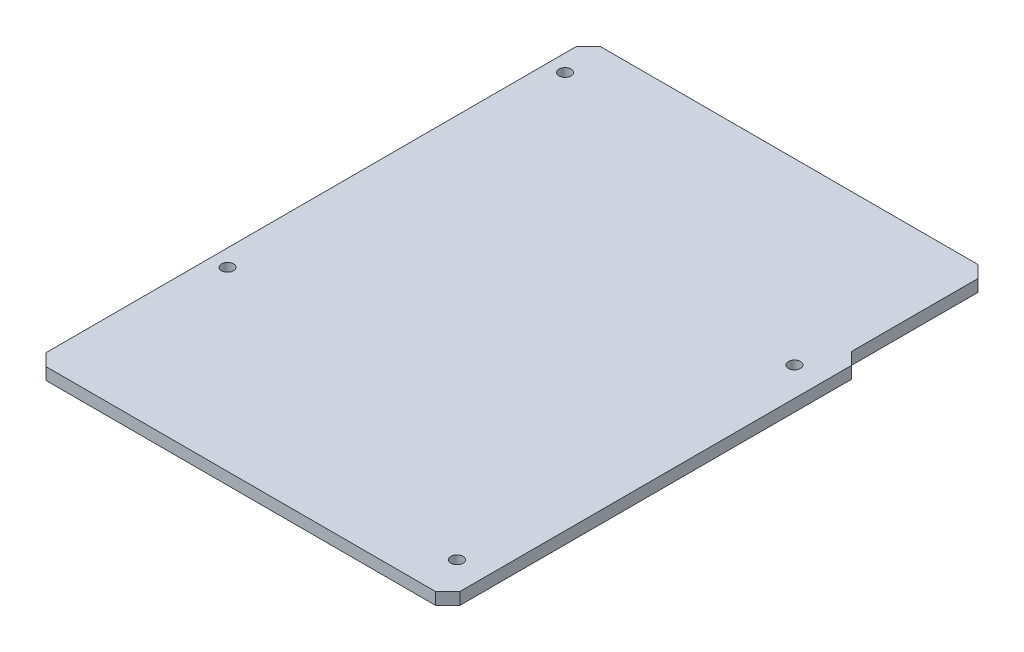
ISO-10303-21;
HEADER;
FILE_DESCRIPTION(('STEP AP214'),'2;1');
FILE_NAME('part.step','',(''),(''),'','','');
FILE_SCHEMA(('AUTOMOTIVE_DESIGN { 1 0 10303 214 1 1 1 1 }'));
ENDSEC;
DATA;
#1=APPLICATION_CONTEXT('core data for automotive mechanical design processes');
#2=APPLICATION_PROTOCOL_DEFINITION('international standard','automotive_design',2000,#1);
#3=PRODUCT_CONTEXT('',#1,'mechanical');
#4=PRODUCT('Part','Part','',(#3));
#5=PRODUCT_RELATED_PRODUCT_CATEGORY('part','',(#4));
#6=PRODUCT_DEFINITION_FORMATION('','',#4);
#7=PRODUCT_DEFINITION_CONTEXT('part definition',#1,'design');
#8=PRODUCT_DEFINITION('design','',#6,#7);
#9=PRODUCT_DEFINITION_SHAPE('','',#8);
#10=(LENGTH_UNIT() NAMED_UNIT(*) SI_UNIT(.MILLI.,.METRE.));
#11=(NAMED_UNIT(*) PLANE_ANGLE_UNIT() SI_UNIT($,.RADIAN.));
#12=(NAMED_UNIT(*) SI_UNIT($,.STERADIAN.) SOLID_ANGLE_UNIT());
#13=UNCERTAINTY_MEASURE_WITH_UNIT(LENGTH_MEASURE(1.E-05),#10,'distance_accuracy_value','');
#14=(GEOMETRIC_REPRESENTATION_CONTEXT(3) GLOBAL_UNCERTAINTY_ASSIGNED_CONTEXT((#13)) GLOBAL_UNIT_ASSIGNED_CONTEXT((#10,
#11,#12)) REPRESENTATION_CONTEXT('',''));
#15=CARTESIAN_POINT('',(0.,0.,0.));
#16=DIRECTION('',(0.,0.,1.));
#17=DIRECTION('',(1.,0.,0.));
#18=AXIS2_PLACEMENT_3D('',#15,#16,#17);
#19=CARTESIAN_POINT('',(0.,3.,0.));
#20=DIRECTION('',(0.,1.,0.));
#21=DIRECTION('',(0.,0.,1.));
#22=AXIS2_PLACEMENT_3D('',#19,#20,#21);
#23=PLANE('',#22);
#24=DIRECTION('',(0.,0.,1.));
#25=VECTOR('',#24,1.);
#26=CARTESIAN_POINT('',(-50.,3.,72.5));
#27=LINE('',#26,#25);
#28=CARTESIAN_POINT('',(-50.,3.,-62.5));
#29=VERTEX_POINT('',#28);
#30=CARTESIAN_POINT('',(-50.,3.,69.5));
#31=VERTEX_POINT('',#30);
#32=EDGE_CURVE('E176',#29,#31,#27,.T.);
#33=ORIENTED_EDGE('',*,*,#32,.T.);
#34=DIRECTION('',(-0.707106781186548,0.,-0.707106781186548));
#35=VECTOR('',#34,1.);
#36=CARTESIAN_POINT('',(-59.75,3.,59.75));
#37=LINE('',#36,#35);
#38=CARTESIAN_POINT('',(-47.,3.,72.5));
#39=VERTEX_POINT('',#38);
#40=EDGE_CURVE('E11',#31,#39,#37,.F.);
#41=ORIENTED_EDGE('',*,*,#40,.T.);
#42=DIRECTION('',(1.,0.,0.));
#43=VECTOR('',#42,1.);
#44=CARTESIAN_POINT('',(50.,3.,72.5));
#45=LINE('',#44,#43);
#46=CARTESIAN_POINT('',(50.,3.,72.5));
#47=VERTEX_POINT('',#46);
#48=EDGE_CURVE('E178',#39,#47,#45,.T.);
#49=ORIENTED_EDGE('',*,*,#48,.T.);
#50=DIRECTION('',(-0.707106781186549,0.,0.707106781186546));
#51=VECTOR('',#50,1.);
#52=CARTESIAN_POINT('',(50.,3.,72.5));
#53=LINE('',#52,#51);
#54=CARTESIAN_POINT('',(53.,3.,69.5));
#55=VERTEX_POINT('',#54);
#56=EDGE_CURVE('E117',#55,#47,#53,.T.);
#57=ORIENTED_EDGE('',*,*,#56,.F.);
#58=DIRECTION('',(0.,0.,1.));
#59=VECTOR('',#58,1.);
#60=CARTESIAN_POINT('',(53.,3.,69.5));
#61=LINE('',#60,#59);
#62=CARTESIAN_POINT('',(53.,3.,-28.));
#63=VERTEX_POINT('',#62);
#64=EDGE_CURVE('E109',#63,#55,#61,.T.);
#65=ORIENTED_EDGE('',*,*,#64,.F.);
#66=DIRECTION('',(0.707106781186548,0.,0.707106781186548));
#67=VECTOR('',#66,1.);
#68=CARTESIAN_POINT('',(53.,3.,-28.));
#69=LINE('',#68,#67);
#70=CARTESIAN_POINT('',(50.,3.,-31.));
#71=VERTEX_POINT('',#70);
#72=EDGE_CURVE('E114',#71,#63,#69,.T.);
#73=ORIENTED_EDGE('',*,*,#72,.F.);
#74=DIRECTION('',(0.,0.,-1.));
#75=VECTOR('',#74,1.);
#76=CARTESIAN_POINT('',(50.,3.,72.5));
#77=LINE('',#76,#75);
#78=CARTESIAN_POINT('',(50.,3.,-62.5));
#79=VERTEX_POINT('',#78);
#80=EDGE_CURVE('E181',#71,#79,#77,.T.);
#81=ORIENTED_EDGE('',*,*,#80,.T.);
#82=DIRECTION('',(0.707106781186549,0.,0.707106781186546));
#83=VECTOR('',#82,1.);
#84=CARTESIAN_POINT('',(56.2499999999999,3.,-56.2500000000002));
#85=LINE('',#84,#83);
#86=CARTESIAN_POINT('',(47.,3.,-65.5));
#87=VERTEX_POINT('',#86);
#88=EDGE_CURVE('E196',#79,#87,#85,.F.);
#89=ORIENTED_EDGE('',*,*,#88,.T.);
#90=DIRECTION('',(1.,0.,0.));
#91=VECTOR('',#90,1.);
#92=CARTESIAN_POINT('',(50.,3.,-65.5));
#93=LINE('',#92,#91);
#94=CARTESIAN_POINT('',(-47.,3.,-65.5));
#95=VERTEX_POINT('',#94);
#96=EDGE_CURVE('E145',#95,#87,#93,.T.);
#97=ORIENTED_EDGE('',*,*,#96,.F.);
#98=DIRECTION('',(0.707106781186548,0.,-0.707106781186548));
#99=VECTOR('',#98,1.);
#100=CARTESIAN_POINT('',(-56.25,3.,-56.25));
#101=LINE('',#100,#99);
#102=EDGE_CURVE('E198',#95,#29,#101,.F.);
#103=ORIENTED_EDGE('',*,*,#102,.T.);
#104=EDGE_LOOP('',(#33,#41,#49,#57,#65,#73,#81,#89,#97,#103));
#105=FACE_BOUND('',#104,.T.);
#106=CARTESIAN_POINT('',(45.8,3.,63.));
#107=DIRECTION('',(0.,1.,0.));
#108=DIRECTION('',(0.,0.,-1.));
#109=AXIS2_PLACEMENT_3D('',#106,#107,#108);
#110=CIRCLE('',#109,1.5);
#111=CARTESIAN_POINT('',(45.8,3.,61.5));
#112=VERTEX_POINT('',#111);
#113=EDGE_CURVE('E158',#112,#112,#110,.T.);
#114=ORIENTED_EDGE('',*,*,#113,.F.);
#115=EDGE_LOOP('',(#114));
#116=FACE_BOUND('',#115,.T.);
#117=CARTESIAN_POINT('',(-45.8,3.,-55.5));
#118=DIRECTION('',(0.,1.,0.));
#119=DIRECTION('',(0.,0.,1.));
#120=AXIS2_PLACEMENT_3D('',#117,#118,#119);
#121=CIRCLE('',#120,1.5);
#122=CARTESIAN_POINT('',(-45.8,3.,-54.));
#123=VERTEX_POINT('',#122);
#124=EDGE_CURVE('E170',#123,#123,#121,.T.);
#125=ORIENTED_EDGE('',*,*,#124,.F.);
#126=EDGE_LOOP('',(#125));
#127=FACE_BOUND('',#126,.T.);
#128=CARTESIAN_POINT('',(-45.8,3.,28.5));
#129=DIRECTION('',(0.,1.,0.));
#130=DIRECTION('',(0.,0.,1.));
#131=AXIS2_PLACEMENT_3D('',#128,#129,#130);
#132=CIRCLE('',#131,1.5);
#133=CARTESIAN_POINT('',(-45.8,3.,30.));
#134=VERTEX_POINT('',#133);
#135=EDGE_CURVE('E164',#134,#134,#132,.T.);
#136=ORIENTED_EDGE('',*,*,#135,.F.);
#137=EDGE_LOOP('',(#136));
#138=FACE_BOUND('',#137,.T.);
#139=CARTESIAN_POINT('',(45.8,3.,-21.));
#140=DIRECTION('',(0.,1.,0.));
#141=DIRECTION('',(0.,0.,-1.));
#142=AXIS2_PLACEMENT_3D('',#139,#140,#141);
#143=CIRCLE('',#142,1.5);
#144=CARTESIAN_POINT('',(45.8,3.,-22.5));
#145=VERTEX_POINT('',#144);
#146=EDGE_CURVE('E152',#145,#145,#143,.T.);
#147=ORIENTED_EDGE('',*,*,#146,.F.);
#148=EDGE_LOOP('',(#147));
#149=FACE_BOUND('',#148,.T.);
#150=ADVANCED_FACE('F33',(#105,#116,#127,#138,#149),#23,.T.);
#151=CARTESIAN_POINT('',(0.,0.,0.));
#152=DIRECTION('',(0.,1.,0.));
#153=DIRECTION('',(0.,0.,1.));
#154=AXIS2_PLACEMENT_3D('',#151,#152,#153);
#155=PLANE('',#154);
#156=DIRECTION('',(1.,0.,0.));
#157=VECTOR('',#156,1.);
#158=CARTESIAN_POINT('',(50.,0.,72.5));
#159=LINE('',#158,#157);
#160=CARTESIAN_POINT('',(-47.,0.,72.5));
#161=VERTEX_POINT('',#160);
#162=CARTESIAN_POINT('',(50.,0.,72.5));
#163=VERTEX_POINT('',#162);
#164=EDGE_CURVE('E185',#161,#163,#159,.T.);
#165=ORIENTED_EDGE('',*,*,#164,.F.);
#166=DIRECTION('',(0.707106781186548,0.,0.707106781186548));
#167=VECTOR('',#166,1.);
#168=CARTESIAN_POINT('',(-47.,0.,72.5));
#169=LINE('',#168,#167);
#170=CARTESIAN_POINT('',(-50.,0.,69.5));
#171=VERTEX_POINT('',#170);
#172=EDGE_CURVE('E55',#161,#171,#169,.F.);
#173=ORIENTED_EDGE('',*,*,#172,.T.);
#174=DIRECTION('',(0.,0.,1.));
#175=VECTOR('',#174,1.);
#176=CARTESIAN_POINT('',(-50.,0.,72.5));
#177=LINE('',#176,#175);
#178=CARTESIAN_POINT('',(-50.,0.,-62.5));
#179=VERTEX_POINT('',#178);
#180=EDGE_CURVE('E173',#179,#171,#177,.T.);
#181=ORIENTED_EDGE('',*,*,#180,.F.);
#182=DIRECTION('',(-0.707106781186548,0.,0.707106781186548));
#183=VECTOR('',#182,1.);
#184=CARTESIAN_POINT('',(-47.,0.,-65.5));
#185=LINE('',#184,#183);
#186=CARTESIAN_POINT('',(-47.,0.,-65.5));
#187=VERTEX_POINT('',#186);
#188=EDGE_CURVE('E204',#179,#187,#185,.F.);
#189=ORIENTED_EDGE('',*,*,#188,.T.);
#190=DIRECTION('',(1.,0.,0.));
#191=VECTOR('',#190,1.);
#192=CARTESIAN_POINT('',(50.,0.,-65.5));
#193=LINE('',#192,#191);
#194=CARTESIAN_POINT('',(47.,0.,-65.5));
#195=VERTEX_POINT('',#194);
#196=EDGE_CURVE('E146',#187,#195,#193,.T.);
#197=ORIENTED_EDGE('',*,*,#196,.T.);
#198=DIRECTION('',(-0.707106781186549,0.,-0.707106781186546));
#199=VECTOR('',#198,1.);
#200=CARTESIAN_POINT('',(50.,0.,-62.5));
#201=LINE('',#200,#199);
#202=CARTESIAN_POINT('',(50.,0.,-62.5));
#203=VERTEX_POINT('',#202);
#204=EDGE_CURVE('E202',#195,#203,#201,.F.);
#205=ORIENTED_EDGE('',*,*,#204,.T.);
#206=DIRECTION('',(0.,0.,-1.));
#207=VECTOR('',#206,1.);
#208=CARTESIAN_POINT('',(50.,0.,72.5));
#209=LINE('',#208,#207);
#210=CARTESIAN_POINT('',(50.,0.,-31.));
#211=VERTEX_POINT('',#210);
#212=EDGE_CURVE('E179',#211,#203,#209,.T.);
#213=ORIENTED_EDGE('',*,*,#212,.F.);
#214=DIRECTION('',(0.707106781186548,0.,0.707106781186548));
#215=VECTOR('',#214,1.);
#216=CARTESIAN_POINT('',(53.,0.,-28.));
#217=LINE('',#216,#215);
#218=CARTESIAN_POINT('',(53.,0.,-28.));
#219=VERTEX_POINT('',#218);
#220=EDGE_CURVE('E140',#211,#219,#217,.T.);
#221=ORIENTED_EDGE('',*,*,#220,.T.);
#222=DIRECTION('',(0.,0.,1.));
#223=VECTOR('',#222,1.);
#224=CARTESIAN_POINT('',(53.,0.,69.5));
#225=LINE('',#224,#223);
#226=CARTESIAN_POINT('',(53.,0.,69.5));
#227=VERTEX_POINT('',#226);
#228=EDGE_CURVE('E126',#219,#227,#225,.T.);
#229=ORIENTED_EDGE('',*,*,#228,.T.);
#230=DIRECTION('',(-0.707106781186549,0.,0.707106781186546));
#231=VECTOR('',#230,1.);
#232=CARTESIAN_POINT('',(50.,0.,72.5));
#233=LINE('',#232,#231);
#234=EDGE_CURVE('E134',#227,#163,#233,.T.);
#235=ORIENTED_EDGE('',*,*,#234,.T.);
#236=EDGE_LOOP('',(#165,#173,#181,#189,#197,#205,#213,#221,#229,#235));
#237=FACE_BOUND('',#236,.T.);
#238=CARTESIAN_POINT('',(-45.8,0.,-55.5));
#239=DIRECTION('',(0.,1.,0.));
#240=DIRECTION('',(0.,0.,1.));
#241=AXIS2_PLACEMENT_3D('',#238,#239,#240);
#242=CIRCLE('',#241,1.5);
#243=CARTESIAN_POINT('',(-45.8,0.,-54.));
#244=VERTEX_POINT('',#243);
#245=EDGE_CURVE('E167',#244,#244,#242,.T.);
#246=ORIENTED_EDGE('',*,*,#245,.T.);
#247=EDGE_LOOP('',(#246));
#248=FACE_BOUND('',#247,.T.);
#249=CARTESIAN_POINT('',(-45.8,0.,28.5));
#250=DIRECTION('',(0.,1.,0.));
#251=DIRECTION('',(0.,0.,1.));
#252=AXIS2_PLACEMENT_3D('',#249,#250,#251);
#253=CIRCLE('',#252,1.5);
#254=CARTESIAN_POINT('',(-45.8,0.,30.));
#255=VERTEX_POINT('',#254);
#256=EDGE_CURVE('E161',#255,#255,#253,.T.);
#257=ORIENTED_EDGE('',*,*,#256,.T.);
#258=EDGE_LOOP('',(#257));
#259=FACE_BOUND('',#258,.T.);
#260=CARTESIAN_POINT('',(45.8,0.,63.));
#261=DIRECTION('',(0.,1.,0.));
#262=DIRECTION('',(0.,0.,-1.));
#263=AXIS2_PLACEMENT_3D('',#260,#261,#262);
#264=CIRCLE('',#263,1.5);
#265=CARTESIAN_POINT('',(45.8,0.,61.5));
#266=VERTEX_POINT('',#265);
#267=EDGE_CURVE('E155',#266,#266,#264,.T.);
#268=ORIENTED_EDGE('',*,*,#267,.T.);
#269=EDGE_LOOP('',(#268));
#270=FACE_BOUND('',#269,.T.);
#271=CARTESIAN_POINT('',(45.8,0.,-21.));
#272=DIRECTION('',(0.,1.,0.));
#273=DIRECTION('',(0.,0.,-1.));
#274=AXIS2_PLACEMENT_3D('',#271,#272,#273);
#275=CIRCLE('',#274,1.5);
#276=CARTESIAN_POINT('',(45.8,0.,-22.5));
#277=VERTEX_POINT('',#276);
#278=EDGE_CURVE('E149',#277,#277,#275,.T.);
#279=ORIENTED_EDGE('',*,*,#278,.T.);
#280=EDGE_LOOP('',(#279));
#281=FACE_BOUND('',#280,.T.);
#282=ADVANCED_FACE('F219',(#237,#248,#259,#270,#281),#155,.F.);
#283=CARTESIAN_POINT('',(-50.,3.,72.5));
#284=DIRECTION('',(1.,0.,0.));
#285=DIRECTION('',(0.,0.,-1.));
#286=AXIS2_PLACEMENT_3D('',#283,#284,#285);
#287=PLANE('',#286);
#288=ORIENTED_EDGE('',*,*,#180,.T.);
#289=DIRECTION('',(0.,1.,0.));
#290=VECTOR('',#289,1.);
#291=CARTESIAN_POINT('',(-50.,3.,69.5));
#292=LINE('',#291,#290);
#293=EDGE_CURVE('E41',#171,#31,#292,.T.);
#294=ORIENTED_EDGE('',*,*,#293,.T.);
#295=ORIENTED_EDGE('',*,*,#32,.F.);
#296=DIRECTION('',(0.,-1.,0.));
#297=VECTOR('',#296,1.);
#298=CARTESIAN_POINT('',(-50.,3.,-62.5));
#299=LINE('',#298,#297);
#300=EDGE_CURVE('E200',#29,#179,#299,.T.);
#301=ORIENTED_EDGE('',*,*,#300,.T.);
#302=EDGE_LOOP('',(#288,#294,#295,#301));
#303=FACE_BOUND('',#302,.T.);
#304=ADVANCED_FACE('F240',(#303),#287,.F.);
#305=CARTESIAN_POINT('',(50.,3.,72.5));
#306=DIRECTION('',(0.,0.,-1.));
#307=DIRECTION('',(-1.,0.,0.));
#308=AXIS2_PLACEMENT_3D('',#305,#306,#307);
#309=PLANE('',#308);
#310=ORIENTED_EDGE('',*,*,#48,.F.);
#311=DIRECTION('',(0.,-1.,0.));
#312=VECTOR('',#311,1.);
#313=CARTESIAN_POINT('',(-47.,3.,72.5));
#314=LINE('',#313,#312);
#315=EDGE_CURVE('E209',#39,#161,#314,.T.);
#316=ORIENTED_EDGE('',*,*,#315,.T.);
#317=ORIENTED_EDGE('',*,*,#164,.T.);
#318=DIRECTION('',(0.,-1.,0.));
#319=VECTOR('',#318,1.);
#320=CARTESIAN_POINT('',(50.,3.,72.5));
#321=LINE('',#320,#319);
#322=EDGE_CURVE('E183',#47,#163,#321,.T.);
#323=ORIENTED_EDGE('',*,*,#322,.F.);
#324=EDGE_LOOP('',(#310,#316,#317,#323));
#325=FACE_BOUND('',#324,.T.);
#326=ADVANCED_FACE('F215',(#325),#309,.F.);
#327=CARTESIAN_POINT('',(50.,3.,72.5));
#328=DIRECTION('',(-1.,0.,0.));
#329=DIRECTION('',(0.,0.,1.));
#330=AXIS2_PLACEMENT_3D('',#327,#328,#329);
#331=PLANE('',#330);
#332=ORIENTED_EDGE('',*,*,#212,.T.);
#333=DIRECTION('',(0.,1.,0.));
#334=VECTOR('',#333,1.);
#335=CARTESIAN_POINT('',(50.,3.,-62.5));
#336=LINE('',#335,#334);
#337=EDGE_CURVE('E206',#203,#79,#336,.T.);
#338=ORIENTED_EDGE('',*,*,#337,.T.);
#339=ORIENTED_EDGE('',*,*,#80,.F.);
#340=DIRECTION('',(0.,-1.,0.));
#341=VECTOR('',#340,1.);
#342=CARTESIAN_POINT('',(50.,106.543469132534,-31.));
#343=LINE('',#342,#341);
#344=EDGE_CURVE('E132',#71,#211,#343,.T.);
#345=ORIENTED_EDGE('',*,*,#344,.T.);
#346=EDGE_LOOP('',(#332,#338,#339,#345));
#347=FACE_BOUND('',#346,.T.);
#348=ADVANCED_FACE('F246',(#347),#331,.F.);
#349=CARTESIAN_POINT('',(-45.8,3.,-55.5));
#350=DIRECTION('',(0.,-1.,0.));
#351=DIRECTION('',(0.,0.,-1.));
#352=AXIS2_PLACEMENT_3D('',#349,#350,#351);
#353=CYLINDRICAL_SURFACE('',#352,1.5);
#354=ORIENTED_EDGE('',*,*,#124,.T.);
#355=EDGE_LOOP('',(#354));
#356=FACE_BOUND('',#355,.T.);
#357=ORIENTED_EDGE('',*,*,#245,.F.);
#358=EDGE_LOOP('',(#357));
#359=FACE_BOUND('',#358,.T.);
#360=ADVANCED_FACE('F243',(#356,#359),#353,.F.);
#361=CARTESIAN_POINT('',(-45.8,3.,28.5));
#362=DIRECTION('',(0.,-1.,0.));
#363=DIRECTION('',(0.,0.,-1.));
#364=AXIS2_PLACEMENT_3D('',#361,#362,#363);
#365=CYLINDRICAL_SURFACE('',#364,1.5);
#366=ORIENTED_EDGE('',*,*,#135,.T.);
#367=EDGE_LOOP('',(#366));
#368=FACE_BOUND('',#367,.T.);
#369=ORIENTED_EDGE('',*,*,#256,.F.);
#370=EDGE_LOOP('',(#369));
#371=FACE_BOUND('',#370,.T.);
#372=ADVANCED_FACE('F282',(#368,#371),#365,.F.);
#373=CARTESIAN_POINT('',(45.8,3.,63.));
#374=DIRECTION('',(0.,-1.,0.));
#375=DIRECTION('',(0.,0.,-1.));
#376=AXIS2_PLACEMENT_3D('',#373,#374,#375);
#377=CYLINDRICAL_SURFACE('',#376,1.5);
#378=ORIENTED_EDGE('',*,*,#113,.T.);
#379=EDGE_LOOP('',(#378));
#380=FACE_BOUND('',#379,.T.);
#381=ORIENTED_EDGE('',*,*,#267,.F.);
#382=EDGE_LOOP('',(#381));
#383=FACE_BOUND('',#382,.T.);
#384=ADVANCED_FACE('F277',(#380,#383),#377,.F.);
#385=CARTESIAN_POINT('',(45.8,3.,-21.));
#386=DIRECTION('',(0.,-1.,0.));
#387=DIRECTION('',(0.,0.,-1.));
#388=AXIS2_PLACEMENT_3D('',#385,#386,#387);
#389=CYLINDRICAL_SURFACE('',#388,1.5);
#390=ORIENTED_EDGE('',*,*,#146,.T.);
#391=EDGE_LOOP('',(#390));
#392=FACE_BOUND('',#391,.T.);
#393=ORIENTED_EDGE('',*,*,#278,.F.);
#394=EDGE_LOOP('',(#393));
#395=FACE_BOUND('',#394,.T.);
#396=ADVANCED_FACE('F270',(#392,#395),#389,.F.);
#397=CARTESIAN_POINT('',(50.,0.,-65.5));
#398=DIRECTION('',(0.,0.,1.));
#399=DIRECTION('',(1.,0.,0.));
#400=AXIS2_PLACEMENT_3D('',#397,#398,#399);
#401=PLANE('',#400);
#402=ORIENTED_EDGE('',*,*,#196,.F.);
#403=DIRECTION('',(0.,1.,0.));
#404=VECTOR('',#403,1.);
#405=CARTESIAN_POINT('',(-47.,0.,-65.5));
#406=LINE('',#405,#404);
#407=EDGE_CURVE('E193',#187,#95,#406,.T.);
#408=ORIENTED_EDGE('',*,*,#407,.T.);
#409=ORIENTED_EDGE('',*,*,#96,.T.);
#410=DIRECTION('',(0.,-1.,0.));
#411=VECTOR('',#410,1.);
#412=CARTESIAN_POINT('',(47.,0.,-65.5));
#413=LINE('',#412,#411);
#414=EDGE_CURVE('E191',#87,#195,#413,.T.);
#415=ORIENTED_EDGE('',*,*,#414,.T.);
#416=EDGE_LOOP('',(#402,#408,#409,#415));
#417=FACE_BOUND('',#416,.T.);
#418=ADVANCED_FACE('F265',(#417),#401,.F.);
#419=CARTESIAN_POINT('',(53.,106.543469132534,-28.));
#420=DIRECTION('',(0.707106781186548,0.,-0.707106781186548));
#421=DIRECTION('',(-0.707106781186548,0.,-0.707106781186548));
#422=AXIS2_PLACEMENT_3D('',#419,#420,#421);
#423=PLANE('',#422);
#424=ORIENTED_EDGE('',*,*,#344,.F.);
#425=ORIENTED_EDGE('',*,*,#72,.T.);
#426=DIRECTION('',(0.,-1.,0.));
#427=VECTOR('',#426,1.);
#428=CARTESIAN_POINT('',(53.,106.543469132534,-28.));
#429=LINE('',#428,#427);
#430=EDGE_CURVE('E121',#63,#219,#429,.T.);
#431=ORIENTED_EDGE('',*,*,#430,.T.);
#432=ORIENTED_EDGE('',*,*,#220,.F.);
#433=EDGE_LOOP('',(#424,#425,#431,#432));
#434=FACE_BOUND('',#433,.T.);
#435=ADVANCED_FACE('F130',(#434),#423,.T.);
#436=CARTESIAN_POINT('',(53.,106.543469132534,69.5));
#437=DIRECTION('',(1.,0.,0.));
#438=DIRECTION('',(0.,0.,-1.));
#439=AXIS2_PLACEMENT_3D('',#436,#437,#438);
#440=PLANE('',#439);
#441=ORIENTED_EDGE('',*,*,#430,.F.);
#442=ORIENTED_EDGE('',*,*,#64,.T.);
#443=DIRECTION('',(0.,-1.,0.));
#444=VECTOR('',#443,1.);
#445=CARTESIAN_POINT('',(53.,106.543469132534,69.5));
#446=LINE('',#445,#444);
#447=EDGE_CURVE('E120',#55,#227,#446,.T.);
#448=ORIENTED_EDGE('',*,*,#447,.T.);
#449=ORIENTED_EDGE('',*,*,#228,.F.);
#450=EDGE_LOOP('',(#441,#442,#448,#449));
#451=FACE_BOUND('',#450,.T.);
#452=ADVANCED_FACE('F124',(#451),#440,.T.);
#453=CARTESIAN_POINT('',(50.,106.543469132534,72.5));
#454=DIRECTION('',(0.707106781186546,0.,0.707106781186549));
#455=DIRECTION('',(0.707106781186549,0.,-0.707106781186546));
#456=AXIS2_PLACEMENT_3D('',#453,#454,#455);
#457=PLANE('',#456);
#458=ORIENTED_EDGE('',*,*,#447,.F.);
#459=ORIENTED_EDGE('',*,*,#56,.T.);
#460=ORIENTED_EDGE('',*,*,#322,.T.);
#461=ORIENTED_EDGE('',*,*,#234,.F.);
#462=EDGE_LOOP('',(#458,#459,#460,#461));
#463=FACE_BOUND('',#462,.T.);
#464=ADVANCED_FACE('F223',(#463),#457,.T.);
#465=CARTESIAN_POINT('',(-47.,0.,-65.5));
#466=DIRECTION('',(0.707106781186548,0.,0.707106781186548));
#467=DIRECTION('',(0.,1.,0.));
#468=AXIS2_PLACEMENT_3D('',#465,#466,#467);
#469=PLANE('',#468);
#470=ORIENTED_EDGE('',*,*,#188,.F.);
#471=ORIENTED_EDGE('',*,*,#300,.F.);
#472=ORIENTED_EDGE('',*,*,#102,.F.);
#473=ORIENTED_EDGE('',*,*,#407,.F.);
#474=EDGE_LOOP('',(#470,#471,#472,#473));
#475=FACE_BOUND('',#474,.T.);
#476=ADVANCED_FACE('F225',(#475),#469,.F.);
#477=CARTESIAN_POINT('',(50.,3.,-62.5));
#478=DIRECTION('',(-0.707106781186546,0.,0.707106781186549));
#479=DIRECTION('',(0.,1.,0.));
#480=AXIS2_PLACEMENT_3D('',#477,#478,#479);
#481=PLANE('',#480);
#482=ORIENTED_EDGE('',*,*,#204,.F.);
#483=ORIENTED_EDGE('',*,*,#414,.F.);
#484=ORIENTED_EDGE('',*,*,#88,.F.);
#485=ORIENTED_EDGE('',*,*,#337,.F.);
#486=EDGE_LOOP('',(#482,#483,#484,#485));
#487=FACE_BOUND('',#486,.T.);
#488=ADVANCED_FACE('F231',(#487),#481,.F.);
#489=CARTESIAN_POINT('',(-47.,3.,72.5));
#490=DIRECTION('',(0.707106781186547,0.,-0.707106781186547));
#491=DIRECTION('',(0.,-1.,0.));
#492=AXIS2_PLACEMENT_3D('',#489,#490,#491);
#493=PLANE('',#492);
#494=ORIENTED_EDGE('',*,*,#40,.F.);
#495=ORIENTED_EDGE('',*,*,#293,.F.);
#496=ORIENTED_EDGE('',*,*,#172,.F.);
#497=ORIENTED_EDGE('',*,*,#315,.F.);
#498=EDGE_LOOP('',(#494,#495,#496,#497));
#499=FACE_BOUND('',#498,.T.);
#500=ADVANCED_FACE('F35',(#499),#493,.F.);
#501=CLOSED_SHELL('',(#150,#282,#304,#326,#348,#360,#372,#384,#396,#418,#435,#452,#464,#476,
#488,#500));
#502=MANIFOLD_SOLID_BREP('B2',#501);
#503=ADVANCED_BREP_SHAPE_REPRESENTATION('',(#18,#502),#14);
#504=SHAPE_DEFINITION_REPRESENTATION(#9,#503);
ENDSEC;
END-ISO-10303-21;
